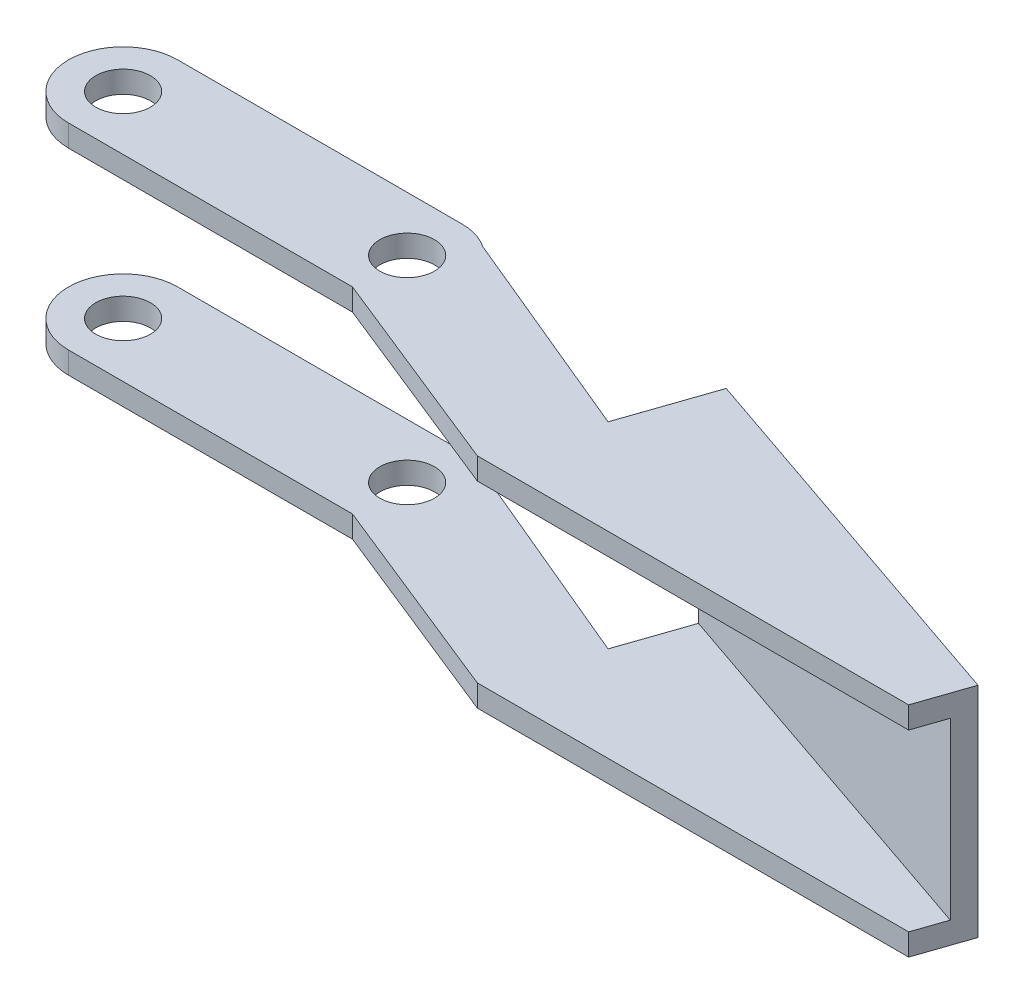
ISO-10303-21;
HEADER;
FILE_DESCRIPTION(('STEP AP214'),'2;1');
FILE_NAME('part.step','',(''),(''),'','','');
FILE_SCHEMA(('AUTOMOTIVE_DESIGN { 1 0 10303 214 1 1 1 1 }'));
ENDSEC;
DATA;
#1=APPLICATION_CONTEXT('core data for automotive mechanical design processes');
#2=APPLICATION_PROTOCOL_DEFINITION('international standard','automotive_design',2000,#1);
#3=PRODUCT_CONTEXT('',#1,'mechanical');
#4=PRODUCT('Part','Part','',(#3));
#5=PRODUCT_RELATED_PRODUCT_CATEGORY('part','',(#4));
#6=PRODUCT_DEFINITION_FORMATION('','',#4);
#7=PRODUCT_DEFINITION_CONTEXT('part definition',#1,'design');
#8=PRODUCT_DEFINITION('design','',#6,#7);
#9=PRODUCT_DEFINITION_SHAPE('','',#8);
#10=(LENGTH_UNIT() NAMED_UNIT(*) SI_UNIT(.MILLI.,.METRE.));
#11=(NAMED_UNIT(*) PLANE_ANGLE_UNIT() SI_UNIT($,.RADIAN.));
#12=(NAMED_UNIT(*) SI_UNIT($,.STERADIAN.) SOLID_ANGLE_UNIT());
#13=UNCERTAINTY_MEASURE_WITH_UNIT(LENGTH_MEASURE(1.E-05),#10,'distance_accuracy_value','');
#14=(GEOMETRIC_REPRESENTATION_CONTEXT(3) GLOBAL_UNCERTAINTY_ASSIGNED_CONTEXT((#13)) GLOBAL_UNIT_ASSIGNED_CONTEXT((#10,
#11,#12)) REPRESENTATION_CONTEXT('',''));
#15=CARTESIAN_POINT('',(0.,0.,0.));
#16=DIRECTION('',(0.,0.,1.));
#17=DIRECTION('',(1.,0.,0.));
#18=AXIS2_PLACEMENT_3D('',#15,#16,#17);
#19=CARTESIAN_POINT('',(0.,0.,0.));
#20=DIRECTION('',(0.,1.,0.));
#21=DIRECTION('',(0.,0.,1.));
#22=AXIS2_PLACEMENT_3D('',#19,#20,#21);
#23=PLANE('',#22);
#24=CARTESIAN_POINT('',(26.,0.,0.));
#25=DIRECTION('',(0.,1.,0.));
#26=DIRECTION('',(0.,0.,1.));
#27=AXIS2_PLACEMENT_3D('',#24,#25,#26);
#28=CIRCLE('',#27,2.5);
#29=CARTESIAN_POINT('',(26.,0.,2.5));
#30=VERTEX_POINT('',#29);
#31=EDGE_CURVE('E246',#30,#30,#28,.T.);
#32=ORIENTED_EDGE('',*,*,#31,.T.);
#33=EDGE_LOOP('',(#32));
#34=FACE_BOUND('',#33,.T.);
#35=CARTESIAN_POINT('',(0.,0.,0.));
#36=DIRECTION('',(0.,1.,0.));
#37=DIRECTION('',(0.,0.,1.));
#38=AXIS2_PLACEMENT_3D('',#35,#36,#37);
#39=CIRCLE('',#38,2.5);
#40=CARTESIAN_POINT('',(0.,0.,2.5));
#41=VERTEX_POINT('',#40);
#42=EDGE_CURVE('E259',#41,#41,#39,.T.);
#43=ORIENTED_EDGE('',*,*,#42,.T.);
#44=EDGE_LOOP('',(#43));
#45=FACE_BOUND('',#44,.T.);
#46=DIRECTION('',(-0.946071645942683,0.,-0.323957467491184));
#47=VECTOR('',#46,1.);
#48=CARTESIAN_POINT('',(50.5028094726619,0.,-2.16332017115032));
#49=LINE('',#48,#47);
#50=CARTESIAN_POINT('',(85.55613766588,0.,9.83977439078125));
#51=VERTEX_POINT('',#50);
#52=CARTESIAN_POINT('',(50.5028094726619,0.,-2.16332017115032));
#53=VERTEX_POINT('',#52);
#54=EDGE_CURVE('E50',#51,#53,#49,.T.);
#55=ORIENTED_EDGE('',*,*,#54,.F.);
#56=DIRECTION('',(0.323957467491184,0.,-0.946071645942683));
#57=VECTOR('',#56,1.);
#58=CARTESIAN_POINT('',(86.2040526008624,0.,7.94763109889588));
#59=LINE('',#58,#57);
#60=CARTESIAN_POINT('',(84.5842652634065,0.,12.6779893286093));
#61=VERTEX_POINT('',#60);
#62=EDGE_CURVE('E223',#61,#51,#59,.T.);
#63=ORIENTED_EDGE('',*,*,#62,.F.);
#64=DIRECTION('',(1.,0.,0.));
#65=VECTOR('',#64,1.);
#66=CARTESIAN_POINT('',(84.5842652634065,0.,12.6779893286093));
#67=LINE('',#66,#65);
#68=CARTESIAN_POINT('',(45.1031159492341,0.,12.6779893286093));
#69=VERTEX_POINT('',#68);
#70=EDGE_CURVE('E220',#69,#61,#67,.T.);
#71=ORIENTED_EDGE('',*,*,#70,.F.);
#72=DIRECTION('',(0.927860020821441,0.,0.372928655055139));
#73=VECTOR('',#72,1.);
#74=CARTESIAN_POINT('',(45.1031159492341,0.,12.6779893286093));
#75=LINE('',#74,#73);
#76=CARTESIAN_POINT('',(26.,0.,5.));
#77=VERTEX_POINT('',#76);
#78=EDGE_CURVE('E217',#77,#69,#75,.T.);
#79=ORIENTED_EDGE('',*,*,#78,.F.);
#80=DIRECTION('',(1.,0.,0.));
#81=VECTOR('',#80,1.);
#82=CARTESIAN_POINT('',(0.,0.,5.));
#83=LINE('',#82,#81);
#84=CARTESIAN_POINT('',(0.,0.,5.));
#85=VERTEX_POINT('',#84);
#86=EDGE_CURVE('E282',#85,#77,#83,.T.);
#87=ORIENTED_EDGE('',*,*,#86,.F.);
#88=CARTESIAN_POINT('',(0.,0.,0.));
#89=DIRECTION('',(0.,1.,0.));
#90=DIRECTION('',(0.,0.,1.));
#91=AXIS2_PLACEMENT_3D('',#88,#89,#90);
#92=CIRCLE('',#91,5.);
#93=CARTESIAN_POINT('',(0.,0.,-5.));
#94=VERTEX_POINT('',#93);
#95=EDGE_CURVE('E265',#94,#85,#92,.T.);
#96=ORIENTED_EDGE('',*,*,#95,.F.);
#97=DIRECTION('',(-1.,0.,0.));
#98=VECTOR('',#97,1.);
#99=CARTESIAN_POINT('',(0.,0.,-5.));
#100=LINE('',#99,#98);
#101=CARTESIAN_POINT('',(26.,0.,-5.));
#102=VERTEX_POINT('',#101);
#103=EDGE_CURVE('E272',#102,#94,#100,.T.);
#104=ORIENTED_EDGE('',*,*,#103,.F.);
#105=CARTESIAN_POINT('',(26.,0.,0.));
#106=DIRECTION('',(0.,1.,0.));
#107=DIRECTION('',(0.,0.,1.));
#108=AXIS2_PLACEMENT_3D('',#105,#106,#107);
#109=CIRCLE('',#108,5.);
#110=CARTESIAN_POINT('',(28.7977331353906,0.,-4.14399436572222));
#111=VERTEX_POINT('',#110);
#112=EDGE_CURVE('E285',#111,#102,#109,.T.);
#113=ORIENTED_EDGE('',*,*,#112,.F.);
#114=DIRECTION('',(-0.923418204726355,0.,-0.383795282904775));
#115=VECTOR('',#114,1.);
#116=CARTESIAN_POINT('',(28.7977331353906,0.,-4.14399436572222));
#117=LINE('',#116,#115);
#118=CARTESIAN_POINT('',(48.3923399718755,0.,4.00000543385411));
#119=VERTEX_POINT('',#118);
#120=EDGE_CURVE('E227',#119,#111,#117,.T.);
#121=ORIENTED_EDGE('',*,*,#120,.F.);
#122=DIRECTION('',(-0.323957467491184,0.,0.946071645942684));
#123=VECTOR('',#122,1.);
#124=CARTESIAN_POINT('',(48.3923399718755,0.,4.00000543385411));
#125=LINE('',#124,#123);
#126=EDGE_CURVE('E225',#53,#119,#125,.T.);
#127=ORIENTED_EDGE('',*,*,#126,.F.);
#128=EDGE_LOOP('',(#55,#63,#71,#79,#87,#96,#104,#113,#121,#127));
#129=FACE_BOUND('',#128,.T.);
#130=ADVANCED_FACE('F35',(#34,#45,#129),#23,.F.);
#131=CARTESIAN_POINT('',(0.,2.,0.));
#132=DIRECTION('',(0.,1.,0.));
#133=DIRECTION('',(0.,0.,1.));
#134=AXIS2_PLACEMENT_3D('',#131,#132,#133);
#135=PLANE('',#134);
#136=DIRECTION('',(-0.923418204726355,0.,-0.383795282904775));
#137=VECTOR('',#136,1.);
#138=CARTESIAN_POINT('',(28.7977331353906,2.,-4.14399436572222));
#139=LINE('',#138,#137);
#140=CARTESIAN_POINT('',(48.3923399718755,2.,4.00000543385411));
#141=VERTEX_POINT('',#140);
#142=CARTESIAN_POINT('',(28.7977331353906,2.,-4.14399436572223));
#143=VERTEX_POINT('',#142);
#144=EDGE_CURVE('E58',#141,#143,#139,.T.);
#145=ORIENTED_EDGE('',*,*,#144,.T.);
#146=CARTESIAN_POINT('',(26.,2.,0.));
#147=DIRECTION('',(0.,1.,0.));
#148=DIRECTION('',(0.,0.,1.));
#149=AXIS2_PLACEMENT_3D('',#146,#147,#148);
#150=CIRCLE('',#149,5.);
#151=CARTESIAN_POINT('',(26.,2.,-5.));
#152=VERTEX_POINT('',#151);
#153=EDGE_CURVE('E275',#143,#152,#150,.T.);
#154=ORIENTED_EDGE('',*,*,#153,.T.);
#155=DIRECTION('',(-1.,0.,0.));
#156=VECTOR('',#155,1.);
#157=CARTESIAN_POINT('',(0.,2.,-5.));
#158=LINE('',#157,#156);
#159=CARTESIAN_POINT('',(0.,2.,-5.));
#160=VERTEX_POINT('',#159);
#161=EDGE_CURVE('E277',#152,#160,#158,.T.);
#162=ORIENTED_EDGE('',*,*,#161,.T.);
#163=CARTESIAN_POINT('',(0.,2.,0.));
#164=DIRECTION('',(0.,1.,0.));
#165=DIRECTION('',(0.,0.,1.));
#166=AXIS2_PLACEMENT_3D('',#163,#164,#165);
#167=CIRCLE('',#166,5.);
#168=CARTESIAN_POINT('',(0.,2.,5.));
#169=VERTEX_POINT('',#168);
#170=EDGE_CURVE('E268',#160,#169,#167,.T.);
#171=ORIENTED_EDGE('',*,*,#170,.T.);
#172=DIRECTION('',(1.,0.,0.));
#173=VECTOR('',#172,1.);
#174=CARTESIAN_POINT('',(0.,2.,5.));
#175=LINE('',#174,#173);
#176=CARTESIAN_POINT('',(26.,2.,5.));
#177=VERTEX_POINT('',#176);
#178=EDGE_CURVE('E271',#169,#177,#175,.T.);
#179=ORIENTED_EDGE('',*,*,#178,.T.);
#180=DIRECTION('',(0.927860020821441,0.,0.372928655055139));
#181=VECTOR('',#180,1.);
#182=CARTESIAN_POINT('',(45.1031159492341,2.,12.6779893286093));
#183=LINE('',#182,#181);
#184=CARTESIAN_POINT('',(45.1031159492341,2.,12.6779893286093));
#185=VERTEX_POINT('',#184);
#186=EDGE_CURVE('E216',#177,#185,#183,.T.);
#187=ORIENTED_EDGE('',*,*,#186,.T.);
#188=DIRECTION('',(1.,0.,0.));
#189=VECTOR('',#188,1.);
#190=CARTESIAN_POINT('',(84.5842652634065,2.,12.6779893286093));
#191=LINE('',#190,#189);
#192=CARTESIAN_POINT('',(84.5842652634065,2.,12.6779893286093));
#193=VERTEX_POINT('',#192);
#194=EDGE_CURVE('E232',#185,#193,#191,.T.);
#195=ORIENTED_EDGE('',*,*,#194,.T.);
#196=DIRECTION('',(0.323957467491184,0.,-0.946071645942683));
#197=VECTOR('',#196,1.);
#198=CARTESIAN_POINT('',(86.2040526008624,2.,7.94763109889588));
#199=LINE('',#198,#197);
#200=CARTESIAN_POINT('',(86.2040526008624,2.,7.94763109889588));
#201=VERTEX_POINT('',#200);
#202=EDGE_CURVE('E235',#193,#201,#199,.T.);
#203=ORIENTED_EDGE('',*,*,#202,.T.);
#204=DIRECTION('',(-0.946071645942683,0.,-0.323957467491184));
#205=VECTOR('',#204,1.);
#206=CARTESIAN_POINT('',(51.1507244076443,2.,-4.05546346303569));
#207=LINE('',#206,#205);
#208=CARTESIAN_POINT('',(51.1507244076443,2.,-4.05546346303569));
#209=VERTEX_POINT('',#208);
#210=EDGE_CURVE('E238',#201,#209,#207,.T.);
#211=ORIENTED_EDGE('',*,*,#210,.T.);
#212=DIRECTION('',(-0.323957467491184,0.,0.946071645942684));
#213=VECTOR('',#212,1.);
#214=CARTESIAN_POINT('',(48.3923399718755,2.,4.00000543385411));
#215=LINE('',#214,#213);
#216=EDGE_CURVE('E241',#209,#141,#215,.T.);
#217=ORIENTED_EDGE('',*,*,#216,.T.);
#218=EDGE_LOOP('',(#145,#154,#162,#171,#179,#187,#195,#203,#211,#217));
#219=FACE_BOUND('',#218,.T.);
#220=CARTESIAN_POINT('',(0.,2.,0.));
#221=DIRECTION('',(0.,1.,0.));
#222=DIRECTION('',(0.,0.,1.));
#223=AXIS2_PLACEMENT_3D('',#220,#221,#222);
#224=CIRCLE('',#223,2.5);
#225=CARTESIAN_POINT('',(0.,2.,2.5));
#226=VERTEX_POINT('',#225);
#227=EDGE_CURVE('E262',#226,#226,#224,.T.);
#228=ORIENTED_EDGE('',*,*,#227,.F.);
#229=EDGE_LOOP('',(#228));
#230=FACE_BOUND('',#229,.T.);
#231=CARTESIAN_POINT('',(26.,2.,0.));
#232=DIRECTION('',(0.,1.,0.));
#233=DIRECTION('',(0.,0.,1.));
#234=AXIS2_PLACEMENT_3D('',#231,#232,#233);
#235=CIRCLE('',#234,2.5);
#236=CARTESIAN_POINT('',(26.,2.,2.5));
#237=VERTEX_POINT('',#236);
#238=EDGE_CURVE('E256',#237,#237,#235,.T.);
#239=ORIENTED_EDGE('',*,*,#238,.F.);
#240=EDGE_LOOP('',(#239));
#241=FACE_BOUND('',#240,.T.);
#242=ADVANCED_FACE('F410',(#219,#230,#241),#135,.T.);
#243=CARTESIAN_POINT('',(0.,2.,0.));
#244=DIRECTION('',(0.,-1.,0.));
#245=DIRECTION('',(0.,0.,-1.));
#246=AXIS2_PLACEMENT_3D('',#243,#244,#245);
#247=CYLINDRICAL_SURFACE('',#246,5.);
#248=ORIENTED_EDGE('',*,*,#95,.T.);
#249=DIRECTION('',(0.,-1.,0.));
#250=VECTOR('',#249,1.);
#251=CARTESIAN_POINT('',(0.,2.,5.));
#252=LINE('',#251,#250);
#253=EDGE_CURVE('E11',#169,#85,#252,.T.);
#254=ORIENTED_EDGE('',*,*,#253,.F.);
#255=ORIENTED_EDGE('',*,*,#170,.F.);
#256=DIRECTION('',(0.,-1.,0.));
#257=VECTOR('',#256,1.);
#258=CARTESIAN_POINT('',(0.,2.,-5.));
#259=LINE('',#258,#257);
#260=EDGE_CURVE('E279',#160,#94,#259,.T.);
#261=ORIENTED_EDGE('',*,*,#260,.T.);
#262=EDGE_LOOP('',(#248,#254,#255,#261));
#263=FACE_BOUND('',#262,.T.);
#264=ADVANCED_FACE('F37',(#263),#247,.T.);
#265=CARTESIAN_POINT('',(0.,2.,5.));
#266=DIRECTION('',(0.,0.,-1.));
#267=DIRECTION('',(-1.,0.,0.));
#268=AXIS2_PLACEMENT_3D('',#265,#266,#267);
#269=PLANE('',#268);
#270=ORIENTED_EDGE('',*,*,#86,.T.);
#271=DIRECTION('',(0.,-1.,0.));
#272=VECTOR('',#271,1.);
#273=CARTESIAN_POINT('',(26.,2.,5.));
#274=LINE('',#273,#272);
#275=EDGE_CURVE('E43',#177,#77,#274,.T.);
#276=ORIENTED_EDGE('',*,*,#275,.F.);
#277=ORIENTED_EDGE('',*,*,#178,.F.);
#278=ORIENTED_EDGE('',*,*,#253,.T.);
#279=EDGE_LOOP('',(#270,#276,#277,#278));
#280=FACE_BOUND('',#279,.T.);
#281=ADVANCED_FACE('F299',(#280),#269,.F.);
#282=CARTESIAN_POINT('',(26.,2.,0.));
#283=DIRECTION('',(0.,-1.,0.));
#284=DIRECTION('',(0.,0.,-1.));
#285=AXIS2_PLACEMENT_3D('',#282,#283,#284);
#286=CYLINDRICAL_SURFACE('',#285,5.);
#287=ORIENTED_EDGE('',*,*,#153,.F.);
#288=DIRECTION('',(0.,1.,0.));
#289=VECTOR('',#288,1.);
#290=CARTESIAN_POINT('',(28.7977331353906,0.,-4.14399436572222));
#291=LINE('',#290,#289);
#292=EDGE_CURVE('E244',#111,#143,#291,.T.);
#293=ORIENTED_EDGE('',*,*,#292,.F.);
#294=ORIENTED_EDGE('',*,*,#112,.T.);
#295=DIRECTION('',(0.,-1.,0.));
#296=VECTOR('',#295,1.);
#297=CARTESIAN_POINT('',(26.,2.,-5.));
#298=LINE('',#297,#296);
#299=EDGE_CURVE('E290',#152,#102,#298,.T.);
#300=ORIENTED_EDGE('',*,*,#299,.F.);
#301=EDGE_LOOP('',(#287,#293,#294,#300));
#302=FACE_BOUND('',#301,.T.);
#303=ADVANCED_FACE('F313',(#302),#286,.T.);
#304=CARTESIAN_POINT('',(0.,2.,-5.));
#305=DIRECTION('',(0.,0.,1.));
#306=DIRECTION('',(1.,0.,0.));
#307=AXIS2_PLACEMENT_3D('',#304,#305,#306);
#308=PLANE('',#307);
#309=ORIENTED_EDGE('',*,*,#103,.T.);
#310=ORIENTED_EDGE('',*,*,#260,.F.);
#311=ORIENTED_EDGE('',*,*,#161,.F.);
#312=ORIENTED_EDGE('',*,*,#299,.T.);
#313=EDGE_LOOP('',(#309,#310,#311,#312));
#314=FACE_BOUND('',#313,.T.);
#315=ADVANCED_FACE('F308',(#314),#308,.F.);
#316=CARTESIAN_POINT('',(0.,2.,0.));
#317=DIRECTION('',(0.,-1.,0.));
#318=DIRECTION('',(0.,0.,-1.));
#319=AXIS2_PLACEMENT_3D('',#316,#317,#318);
#320=CYLINDRICAL_SURFACE('',#319,2.5);
#321=ORIENTED_EDGE('',*,*,#227,.T.);
#322=EDGE_LOOP('',(#321));
#323=FACE_BOUND('',#322,.T.);
#324=ORIENTED_EDGE('',*,*,#42,.F.);
#325=EDGE_LOOP('',(#324));
#326=FACE_BOUND('',#325,.T.);
#327=ADVANCED_FACE('F438',(#323,#326),#320,.F.);
#328=CARTESIAN_POINT('',(26.,2.,0.));
#329=DIRECTION('',(0.,-1.,0.));
#330=DIRECTION('',(0.,0.,-1.));
#331=AXIS2_PLACEMENT_3D('',#328,#329,#330);
#332=CYLINDRICAL_SURFACE('',#331,2.5);
#333=ORIENTED_EDGE('',*,*,#238,.T.);
#334=EDGE_LOOP('',(#333));
#335=FACE_BOUND('',#334,.T.);
#336=ORIENTED_EDGE('',*,*,#31,.F.);
#337=EDGE_LOOP('',(#336));
#338=FACE_BOUND('',#337,.T.);
#339=ADVANCED_FACE('F468',(#335,#338),#332,.F.);
#340=CARTESIAN_POINT('',(28.7977331353906,0.,-4.14399436572222));
#341=DIRECTION('',(0.383795282904775,0.,-0.923418204726355));
#342=DIRECTION('',(-0.923418204726355,0.,-0.383795282904775));
#343=AXIS2_PLACEMENT_3D('',#340,#341,#342);
#344=PLANE('',#343);
#345=ORIENTED_EDGE('',*,*,#144,.F.);
#346=DIRECTION('',(0.,1.,0.));
#347=VECTOR('',#346,1.);
#348=CARTESIAN_POINT('',(48.3923399718755,0.,4.00000543385411));
#349=LINE('',#348,#347);
#350=EDGE_CURVE('E247',#119,#141,#349,.T.);
#351=ORIENTED_EDGE('',*,*,#350,.F.);
#352=ORIENTED_EDGE('',*,*,#120,.T.);
#353=ORIENTED_EDGE('',*,*,#292,.T.);
#354=EDGE_LOOP('',(#345,#351,#352,#353));
#355=FACE_BOUND('',#354,.T.);
#356=ADVANCED_FACE('F316',(#355),#344,.T.);
#357=CARTESIAN_POINT('',(48.3923399718755,0.,4.00000543385411));
#358=DIRECTION('',(-0.946071645942684,0.,-0.323957467491184));
#359=DIRECTION('',(-0.323957467491184,0.,0.946071645942684));
#360=AXIS2_PLACEMENT_3D('',#357,#358,#359);
#361=PLANE('',#360);
#362=ORIENTED_EDGE('',*,*,#216,.F.);
#363=DIRECTION('',(0.,1.,0.));
#364=VECTOR('',#363,1.);
#365=CARTESIAN_POINT('',(51.1507244076443,0.,-4.05546346303569));
#366=LINE('',#365,#364);
#367=CARTESIAN_POINT('',(51.1507244076443,-18.,-4.05546346303569));
#368=VERTEX_POINT('',#367);
#369=EDGE_CURVE('E249',#368,#209,#366,.T.);
#370=ORIENTED_EDGE('',*,*,#369,.F.);
#371=DIRECTION('',(-0.323957467491184,0.,0.946071645942684));
#372=VECTOR('',#371,1.);
#373=CARTESIAN_POINT('',(44.5395889112522,-18.,15.2514161994681));
#374=LINE('',#373,#372);
#375=CARTESIAN_POINT('',(48.3923399718755,-18.,4.00000543385411));
#376=VERTEX_POINT('',#375);
#377=EDGE_CURVE('E398',#368,#376,#374,.T.);
#378=ORIENTED_EDGE('',*,*,#377,.T.);
#379=DIRECTION('',(0.,1.,0.));
#380=VECTOR('',#379,1.);
#381=CARTESIAN_POINT('',(48.3923399718755,-18.,4.00000543385411));
#382=LINE('',#381,#380);
#383=CARTESIAN_POINT('',(48.3923399718755,-16.,4.00000543385411));
#384=VERTEX_POINT('',#383);
#385=EDGE_CURVE('E204',#376,#384,#382,.T.);
#386=ORIENTED_EDGE('',*,*,#385,.T.);
#387=DIRECTION('',(-0.323957467491184,0.,0.946071645942684));
#388=VECTOR('',#387,1.);
#389=CARTESIAN_POINT('',(44.5395889112522,-16.,15.2514161994681));
#390=LINE('',#389,#388);
#391=CARTESIAN_POINT('',(50.5028094726619,-16.,-2.16332017115032));
#392=VERTEX_POINT('',#391);
#393=EDGE_CURVE('E326',#392,#384,#390,.T.);
#394=ORIENTED_EDGE('',*,*,#393,.F.);
#395=DIRECTION('',(0.,1.,0.));
#396=VECTOR('',#395,1.);
#397=CARTESIAN_POINT('',(50.5028094726619,-16.,-2.16332017115032));
#398=LINE('',#397,#396);
#399=EDGE_CURVE('E209',#392,#53,#398,.T.);
#400=ORIENTED_EDGE('',*,*,#399,.T.);
#401=ORIENTED_EDGE('',*,*,#126,.T.);
#402=ORIENTED_EDGE('',*,*,#350,.T.);
#403=EDGE_LOOP('',(#362,#370,#378,#386,#394,#400,#401,#402));
#404=FACE_BOUND('',#403,.T.);
#405=ADVANCED_FACE('F324',(#404),#361,.T.);
#406=CARTESIAN_POINT('',(51.1507244076443,0.,-4.05546346303569));
#407=DIRECTION('',(0.323957467491184,0.,-0.946071645942683));
#408=DIRECTION('',(-0.946071645942684,0.,-0.323957467491184));
#409=AXIS2_PLACEMENT_3D('',#406,#407,#408);
#410=PLANE('',#409);
#411=ORIENTED_EDGE('',*,*,#210,.F.);
#412=DIRECTION('',(0.,1.,0.));
#413=VECTOR('',#412,1.);
#414=CARTESIAN_POINT('',(86.2040526008624,0.,7.94763109889588));
#415=LINE('',#414,#413);
#416=CARTESIAN_POINT('',(86.2040526008624,-18.,7.94763109889588));
#417=VERTEX_POINT('',#416);
#418=EDGE_CURVE('E251',#417,#201,#415,.T.);
#419=ORIENTED_EDGE('',*,*,#418,.F.);
#420=DIRECTION('',(0.946071645942684,0.,0.323957467491184));
#421=VECTOR('',#420,1.);
#422=CARTESIAN_POINT('',(6.6111354963921,-18.,-19.3068796625038));
#423=LINE('',#422,#421);
#424=EDGE_CURVE('E400',#368,#417,#423,.T.);
#425=ORIENTED_EDGE('',*,*,#424,.F.);
#426=ORIENTED_EDGE('',*,*,#369,.T.);
#427=EDGE_LOOP('',(#411,#419,#425,#426));
#428=FACE_BOUND('',#427,.T.);
#429=ADVANCED_FACE('F409',(#428),#410,.T.);
#430=CARTESIAN_POINT('',(86.2040526008624,0.,7.94763109889588));
#431=DIRECTION('',(0.946071645942683,0.,0.323957467491184));
#432=DIRECTION('',(0.323957467491185,0.,-0.946071645942684));
#433=AXIS2_PLACEMENT_3D('',#430,#431,#432);
#434=PLANE('',#433);
#435=ORIENTED_EDGE('',*,*,#202,.F.);
#436=DIRECTION('',(0.,1.,0.));
#437=VECTOR('',#436,1.);
#438=CARTESIAN_POINT('',(84.5842652634065,0.,12.6779893286093));
#439=LINE('',#438,#437);
#440=EDGE_CURVE('E253',#61,#193,#439,.T.);
#441=ORIENTED_EDGE('',*,*,#440,.F.);
#442=ORIENTED_EDGE('',*,*,#62,.T.);
#443=DIRECTION('',(0.,1.,0.));
#444=VECTOR('',#443,1.);
#445=CARTESIAN_POINT('',(85.55613766588,-16.,9.83977439078125));
#446=LINE('',#445,#444);
#447=CARTESIAN_POINT('',(85.55613766588,-16.,9.83977439078125));
#448=VERTEX_POINT('',#447);
#449=EDGE_CURVE('E213',#448,#51,#446,.T.);
#450=ORIENTED_EDGE('',*,*,#449,.F.);
#451=DIRECTION('',(-0.323957467491185,0.,0.946071645942684));
#452=VECTOR('',#451,1.);
#453=CARTESIAN_POINT('',(79.5929171044703,-16.,27.2545107613997));
#454=LINE('',#453,#452);
#455=CARTESIAN_POINT('',(84.5842652634065,-16.,12.6779893286093));
#456=VERTEX_POINT('',#455);
#457=EDGE_CURVE('E331',#448,#456,#454,.T.);
#458=ORIENTED_EDGE('',*,*,#457,.T.);
#459=DIRECTION('',(0.,1.,0.));
#460=VECTOR('',#459,1.);
#461=CARTESIAN_POINT('',(84.5842652634065,-18.,12.6779893286093));
#462=LINE('',#461,#460);
#463=CARTESIAN_POINT('',(84.5842652634065,-18.,12.6779893286093));
#464=VERTEX_POINT('',#463);
#465=EDGE_CURVE('E359',#464,#456,#462,.T.);
#466=ORIENTED_EDGE('',*,*,#465,.F.);
#467=DIRECTION('',(-0.323957467491185,0.,0.946071645942684));
#468=VECTOR('',#467,1.);
#469=CARTESIAN_POINT('',(79.5929171044703,-18.,27.2545107613997));
#470=LINE('',#469,#468);
#471=EDGE_CURVE('E384',#417,#464,#470,.T.);
#472=ORIENTED_EDGE('',*,*,#471,.F.);
#473=ORIENTED_EDGE('',*,*,#418,.T.);
#474=EDGE_LOOP('',(#435,#441,#442,#450,#458,#466,#472,#473));
#475=FACE_BOUND('',#474,.T.);
#476=ADVANCED_FACE('F406',(#475),#434,.T.);
#477=CARTESIAN_POINT('',(84.5842652634065,0.,12.6779893286093));
#478=DIRECTION('',(0.,0.,1.));
#479=DIRECTION('',(1.,0.,0.));
#480=AXIS2_PLACEMENT_3D('',#477,#478,#479);
#481=PLANE('',#480);
#482=ORIENTED_EDGE('',*,*,#194,.F.);
#483=DIRECTION('',(0.,1.,0.));
#484=VECTOR('',#483,1.);
#485=CARTESIAN_POINT('',(45.1031159492341,0.,12.6779893286093));
#486=LINE('',#485,#484);
#487=EDGE_CURVE('E229',#69,#185,#486,.T.);
#488=ORIENTED_EDGE('',*,*,#487,.F.);
#489=ORIENTED_EDGE('',*,*,#70,.T.);
#490=ORIENTED_EDGE('',*,*,#440,.T.);
#491=EDGE_LOOP('',(#482,#488,#489,#490));
#492=FACE_BOUND('',#491,.T.);
#493=ADVANCED_FACE('F414',(#492),#481,.T.);
#494=CARTESIAN_POINT('',(45.1031159492341,0.,12.6779893286093));
#495=DIRECTION('',(-0.372928655055139,0.,0.927860020821441));
#496=DIRECTION('',(0.927860020821441,0.,0.372928655055139));
#497=AXIS2_PLACEMENT_3D('',#494,#495,#496);
#498=PLANE('',#497);
#499=ORIENTED_EDGE('',*,*,#186,.F.);
#500=ORIENTED_EDGE('',*,*,#275,.T.);
#501=ORIENTED_EDGE('',*,*,#78,.T.);
#502=ORIENTED_EDGE('',*,*,#487,.T.);
#503=EDGE_LOOP('',(#499,#500,#501,#502));
#504=FACE_BOUND('',#503,.T.);
#505=ADVANCED_FACE('F295',(#504),#498,.T.);
#506=CARTESIAN_POINT('',(50.5028094726619,-16.,-2.16332017115032));
#507=DIRECTION('',(0.323957467491184,0.,-0.946071645942683));
#508=DIRECTION('',(-0.946071645942684,0.,-0.323957467491184));
#509=AXIS2_PLACEMENT_3D('',#506,#507,#508);
#510=PLANE('',#509);
#511=ORIENTED_EDGE('',*,*,#54,.T.);
#512=ORIENTED_EDGE('',*,*,#399,.F.);
#513=DIRECTION('',(-0.946071645942683,0.,-0.323957467491184));
#514=VECTOR('',#513,1.);
#515=CARTESIAN_POINT('',(50.5028094726619,-16.,-2.16332017115032));
#516=LINE('',#515,#514);
#517=EDGE_CURVE('E202',#448,#392,#516,.T.);
#518=ORIENTED_EDGE('',*,*,#517,.F.);
#519=ORIENTED_EDGE('',*,*,#449,.T.);
#520=EDGE_LOOP('',(#511,#512,#518,#519));
#521=FACE_BOUND('',#520,.T.);
#522=ADVANCED_FACE('F320',(#521),#510,.F.);
#523=CARTESIAN_POINT('',(0.,-16.,0.));
#524=DIRECTION('',(0.,-1.,0.));
#525=DIRECTION('',(0.,0.,-1.));
#526=AXIS2_PLACEMENT_3D('',#523,#524,#525);
#527=PLANE('',#526);
#528=CARTESIAN_POINT('',(26.,-16.,0.));
#529=DIRECTION('',(0.,-1.,0.));
#530=DIRECTION('',(0.,0.,-1.));
#531=AXIS2_PLACEMENT_3D('',#528,#529,#530);
#532=CIRCLE('',#531,2.5);
#533=CARTESIAN_POINT('',(26.,-16.,-2.5));
#534=VERTEX_POINT('',#533);
#535=EDGE_CURVE('E389',#534,#534,#532,.T.);
#536=ORIENTED_EDGE('',*,*,#535,.T.);
#537=EDGE_LOOP('',(#536));
#538=FACE_BOUND('',#537,.T.);
#539=CARTESIAN_POINT('',(0.,-16.,0.));
#540=DIRECTION('',(0.,-1.,0.));
#541=DIRECTION('',(0.,0.,-1.));
#542=AXIS2_PLACEMENT_3D('',#539,#540,#541);
#543=CIRCLE('',#542,2.5);
#544=CARTESIAN_POINT('',(0.,-16.,-2.5));
#545=VERTEX_POINT('',#544);
#546=EDGE_CURVE('E392',#545,#545,#543,.T.);
#547=ORIENTED_EDGE('',*,*,#546,.T.);
#548=EDGE_LOOP('',(#547));
#549=FACE_BOUND('',#548,.T.);
#550=ORIENTED_EDGE('',*,*,#457,.F.);
#551=ORIENTED_EDGE('',*,*,#517,.T.);
#552=ORIENTED_EDGE('',*,*,#393,.T.);
#553=DIRECTION('',(-0.922126073459837,0.,-0.386889525117369));
#554=VECTOR('',#553,1.);
#555=CARTESIAN_POINT('',(5.81648943176526,-16.,-13.863225062522));
#556=LINE('',#555,#554);
#557=CARTESIAN_POINT('',(27.4628786982161,-16.,-4.78121176212742));
#558=VERTEX_POINT('',#557);
#559=EDGE_CURVE('E332',#384,#558,#556,.T.);
#560=ORIENTED_EDGE('',*,*,#559,.T.);
#561=CARTESIAN_POINT('',(26.,-16.,0.));
#562=DIRECTION('',(0.,-1.,0.));
#563=DIRECTION('',(0.,0.,-1.));
#564=AXIS2_PLACEMENT_3D('',#561,#562,#563);
#565=CIRCLE('',#564,5.);
#566=CARTESIAN_POINT('',(26.,-16.,-5.));
#567=VERTEX_POINT('',#566);
#568=EDGE_CURVE('E336',#567,#558,#565,.T.);
#569=ORIENTED_EDGE('',*,*,#568,.F.);
#570=DIRECTION('',(1.,0.,0.));
#571=VECTOR('',#570,1.);
#572=CARTESIAN_POINT('',(0.,-16.,-5.));
#573=LINE('',#572,#571);
#574=CARTESIAN_POINT('',(0.,-16.,-5.));
#575=VERTEX_POINT('',#574);
#576=EDGE_CURVE('E200',#575,#567,#573,.T.);
#577=ORIENTED_EDGE('',*,*,#576,.F.);
#578=CARTESIAN_POINT('',(0.,-16.,0.));
#579=DIRECTION('',(0.,-1.,0.));
#580=DIRECTION('',(0.,0.,-1.));
#581=AXIS2_PLACEMENT_3D('',#578,#579,#580);
#582=CIRCLE('',#581,5.);
#583=CARTESIAN_POINT('',(0.,-16.,5.));
#584=VERTEX_POINT('',#583);
#585=EDGE_CURVE('E347',#584,#575,#582,.T.);
#586=ORIENTED_EDGE('',*,*,#585,.F.);
#587=DIRECTION('',(1.,0.,0.));
#588=VECTOR('',#587,1.);
#589=CARTESIAN_POINT('',(0.,-16.,5.));
#590=LINE('',#589,#588);
#591=CARTESIAN_POINT('',(26.,-16.,5.));
#592=VERTEX_POINT('',#591);
#593=EDGE_CURVE('E344',#584,#592,#590,.T.);
#594=ORIENTED_EDGE('',*,*,#593,.T.);
#595=DIRECTION('',(-0.927860020821441,0.,-0.372928655055139));
#596=VECTOR('',#595,1.);
#597=CARTESIAN_POINT('',(1.88584237757024,-16.,-4.69204423955988));
#598=LINE('',#597,#596);
#599=CARTESIAN_POINT('',(45.1031159492341,-16.,12.6779893286093));
#600=VERTEX_POINT('',#599);
#601=EDGE_CURVE('E341',#600,#592,#598,.T.);
#602=ORIENTED_EDGE('',*,*,#601,.F.);
#603=DIRECTION('',(-1.,0.,0.));
#604=VECTOR('',#603,1.);
#605=CARTESIAN_POINT('',(0.,-16.,12.6779893286093));
#606=LINE('',#605,#604);
#607=EDGE_CURVE('E334',#456,#600,#606,.T.);
#608=ORIENTED_EDGE('',*,*,#607,.F.);
#609=EDGE_LOOP('',(#550,#551,#552,#560,#569,#577,#586,#594,#602,#608));
#610=FACE_BOUND('',#609,.T.);
#611=ADVANCED_FACE('F372',(#538,#549,#610),#527,.F.);
#612=CARTESIAN_POINT('',(0.,-18.,-5.));
#613=DIRECTION('',(0.,0.,1.));
#614=DIRECTION('',(1.,0.,0.));
#615=AXIS2_PLACEMENT_3D('',#612,#613,#614);
#616=PLANE('',#615);
#617=ORIENTED_EDGE('',*,*,#576,.T.);
#618=DIRECTION('',(0.,1.,0.));
#619=VECTOR('',#618,1.);
#620=CARTESIAN_POINT('',(26.,-18.,-5.));
#621=LINE('',#620,#619);
#622=CARTESIAN_POINT('',(26.,-18.,-5.));
#623=VERTEX_POINT('',#622);
#624=EDGE_CURVE('E179',#623,#567,#621,.T.);
#625=ORIENTED_EDGE('',*,*,#624,.F.);
#626=DIRECTION('',(1.,0.,0.));
#627=VECTOR('',#626,1.);
#628=CARTESIAN_POINT('',(0.,-18.,-5.));
#629=LINE('',#628,#627);
#630=CARTESIAN_POINT('',(0.,-18.,-5.));
#631=VERTEX_POINT('',#630);
#632=EDGE_CURVE('E186',#631,#623,#629,.T.);
#633=ORIENTED_EDGE('',*,*,#632,.F.);
#634=DIRECTION('',(0.,1.,0.));
#635=VECTOR('',#634,1.);
#636=CARTESIAN_POINT('',(0.,-18.,-5.));
#637=LINE('',#636,#635);
#638=EDGE_CURVE('E350',#631,#575,#637,.T.);
#639=ORIENTED_EDGE('',*,*,#638,.T.);
#640=EDGE_LOOP('',(#617,#625,#633,#639));
#641=FACE_BOUND('',#640,.T.);
#642=ADVANCED_FACE('F198',(#641),#616,.F.);
#643=CARTESIAN_POINT('',(26.,-18.,0.));
#644=DIRECTION('',(0.,1.,0.));
#645=DIRECTION('',(0.,0.,1.));
#646=AXIS2_PLACEMENT_3D('',#643,#644,#645);
#647=CYLINDRICAL_SURFACE('',#646,5.);
#648=ORIENTED_EDGE('',*,*,#568,.T.);
#649=DIRECTION('',(0.,1.,0.));
#650=VECTOR('',#649,1.);
#651=CARTESIAN_POINT('',(27.4628786982161,-18.,-4.78121176212742));
#652=LINE('',#651,#650);
#653=CARTESIAN_POINT('',(27.4628786982161,-18.,-4.78121176212742));
#654=VERTEX_POINT('',#653);
#655=EDGE_CURVE('E181',#654,#558,#652,.T.);
#656=ORIENTED_EDGE('',*,*,#655,.F.);
#657=CARTESIAN_POINT('',(26.,-18.,0.));
#658=DIRECTION('',(0.,-1.,0.));
#659=DIRECTION('',(0.,0.,-1.));
#660=AXIS2_PLACEMENT_3D('',#657,#658,#659);
#661=CIRCLE('',#660,5.);
#662=EDGE_CURVE('E174',#623,#654,#661,.T.);
#663=ORIENTED_EDGE('',*,*,#662,.F.);
#664=ORIENTED_EDGE('',*,*,#624,.T.);
#665=EDGE_LOOP('',(#648,#656,#663,#664));
#666=FACE_BOUND('',#665,.T.);
#667=ADVANCED_FACE('F177',(#666),#647,.T.);
#668=CARTESIAN_POINT('',(5.81648943176526,-18.,-13.863225062522));
#669=DIRECTION('',(0.386889525117369,0.,-0.922126073459837));
#670=DIRECTION('',(-0.922126073459837,0.,-0.386889525117369));
#671=AXIS2_PLACEMENT_3D('',#668,#669,#670);
#672=PLANE('',#671);
#673=ORIENTED_EDGE('',*,*,#559,.F.);
#674=ORIENTED_EDGE('',*,*,#385,.F.);
#675=DIRECTION('',(-0.922126073459837,0.,-0.386889525117369));
#676=VECTOR('',#675,1.);
#677=CARTESIAN_POINT('',(5.81648943176526,-18.,-13.863225062522));
#678=LINE('',#677,#676);
#679=EDGE_CURVE('E185',#376,#654,#678,.T.);
#680=ORIENTED_EDGE('',*,*,#679,.T.);
#681=ORIENTED_EDGE('',*,*,#655,.T.);
#682=EDGE_LOOP('',(#673,#674,#680,#681));
#683=FACE_BOUND('',#682,.T.);
#684=ADVANCED_FACE('F396',(#683),#672,.T.);
#685=CARTESIAN_POINT('',(0.,-18.,12.6779893286093));
#686=DIRECTION('',(0.,0.,-1.));
#687=DIRECTION('',(-1.,0.,0.));
#688=AXIS2_PLACEMENT_3D('',#685,#686,#687);
#689=PLANE('',#688);
#690=ORIENTED_EDGE('',*,*,#607,.T.);
#691=DIRECTION('',(0.,1.,0.));
#692=VECTOR('',#691,1.);
#693=CARTESIAN_POINT('',(45.1031159492341,-18.,12.6779893286093));
#694=LINE('',#693,#692);
#695=CARTESIAN_POINT('',(45.1031159492341,-18.,12.6779893286093));
#696=VERTEX_POINT('',#695);
#697=EDGE_CURVE('E356',#696,#600,#694,.T.);
#698=ORIENTED_EDGE('',*,*,#697,.F.);
#699=DIRECTION('',(-1.,0.,0.));
#700=VECTOR('',#699,1.);
#701=CARTESIAN_POINT('',(0.,-18.,12.6779893286093));
#702=LINE('',#701,#700);
#703=EDGE_CURVE('E367',#464,#696,#702,.T.);
#704=ORIENTED_EDGE('',*,*,#703,.F.);
#705=ORIENTED_EDGE('',*,*,#465,.T.);
#706=EDGE_LOOP('',(#690,#698,#704,#705));
#707=FACE_BOUND('',#706,.T.);
#708=ADVANCED_FACE('F365',(#707),#689,.F.);
#709=CARTESIAN_POINT('',(1.88584237757024,-18.,-4.69204423955988));
#710=DIRECTION('',(0.372928655055139,0.,-0.927860020821441));
#711=DIRECTION('',(-0.927860020821441,0.,-0.372928655055139));
#712=AXIS2_PLACEMENT_3D('',#709,#710,#711);
#713=PLANE('',#712);
#714=ORIENTED_EDGE('',*,*,#601,.T.);
#715=DIRECTION('',(0.,1.,0.));
#716=VECTOR('',#715,1.);
#717=CARTESIAN_POINT('',(26.,-18.,5.));
#718=LINE('',#717,#716);
#719=CARTESIAN_POINT('',(26.,-18.,5.));
#720=VERTEX_POINT('',#719);
#721=EDGE_CURVE('E354',#720,#592,#718,.T.);
#722=ORIENTED_EDGE('',*,*,#721,.F.);
#723=DIRECTION('',(-0.927860020821441,0.,-0.372928655055139));
#724=VECTOR('',#723,1.);
#725=CARTESIAN_POINT('',(1.88584237757024,-18.,-4.69204423955988));
#726=LINE('',#725,#724);
#727=EDGE_CURVE('E380',#696,#720,#726,.T.);
#728=ORIENTED_EDGE('',*,*,#727,.F.);
#729=ORIENTED_EDGE('',*,*,#697,.T.);
#730=EDGE_LOOP('',(#714,#722,#728,#729));
#731=FACE_BOUND('',#730,.T.);
#732=ADVANCED_FACE('F377',(#731),#713,.F.);
#733=CARTESIAN_POINT('',(0.,-18.,5.));
#734=DIRECTION('',(0.,0.,1.));
#735=DIRECTION('',(1.,0.,0.));
#736=AXIS2_PLACEMENT_3D('',#733,#734,#735);
#737=PLANE('',#736);
#738=ORIENTED_EDGE('',*,*,#593,.F.);
#739=DIRECTION('',(0.,1.,0.));
#740=VECTOR('',#739,1.);
#741=CARTESIAN_POINT('',(0.,-18.,5.));
#742=LINE('',#741,#740);
#743=CARTESIAN_POINT('',(0.,-18.,5.));
#744=VERTEX_POINT('',#743);
#745=EDGE_CURVE('E352',#744,#584,#742,.T.);
#746=ORIENTED_EDGE('',*,*,#745,.F.);
#747=DIRECTION('',(1.,0.,0.));
#748=VECTOR('',#747,1.);
#749=CARTESIAN_POINT('',(0.,-18.,5.));
#750=LINE('',#749,#748);
#751=EDGE_CURVE('E381',#744,#720,#750,.T.);
#752=ORIENTED_EDGE('',*,*,#751,.T.);
#753=ORIENTED_EDGE('',*,*,#721,.T.);
#754=EDGE_LOOP('',(#738,#746,#752,#753));
#755=FACE_BOUND('',#754,.T.);
#756=ADVANCED_FACE('F563',(#755),#737,.T.);
#757=CARTESIAN_POINT('',(0.,-18.,0.));
#758=DIRECTION('',(0.,1.,0.));
#759=DIRECTION('',(0.,0.,1.));
#760=AXIS2_PLACEMENT_3D('',#757,#758,#759);
#761=CYLINDRICAL_SURFACE('',#760,2.5);
#762=CARTESIAN_POINT('',(0.,-18.,0.));
#763=DIRECTION('',(0.,-1.,0.));
#764=DIRECTION('',(0.,0.,-1.));
#765=AXIS2_PLACEMENT_3D('',#762,#763,#764);
#766=CIRCLE('',#765,2.5);
#767=CARTESIAN_POINT('',(0.,-18.,-2.5));
#768=VERTEX_POINT('',#767);
#769=EDGE_CURVE('E196',#768,#768,#766,.T.);
#770=ORIENTED_EDGE('',*,*,#769,.T.);
#771=EDGE_LOOP('',(#770));
#772=FACE_BOUND('',#771,.T.);
#773=ORIENTED_EDGE('',*,*,#546,.F.);
#774=EDGE_LOOP('',(#773));
#775=FACE_BOUND('',#774,.T.);
#776=ADVANCED_FACE('F570',(#772,#775),#761,.F.);
#777=CARTESIAN_POINT('',(26.,-18.,0.));
#778=DIRECTION('',(0.,1.,0.));
#779=DIRECTION('',(0.,0.,1.));
#780=AXIS2_PLACEMENT_3D('',#777,#778,#779);
#781=CYLINDRICAL_SURFACE('',#780,2.5);
#782=CARTESIAN_POINT('',(26.,-18.,0.));
#783=DIRECTION('',(0.,-1.,0.));
#784=DIRECTION('',(0.,0.,-1.));
#785=AXIS2_PLACEMENT_3D('',#782,#783,#784);
#786=CIRCLE('',#785,2.5);
#787=CARTESIAN_POINT('',(26.,-18.,-2.5));
#788=VERTEX_POINT('',#787);
#789=EDGE_CURVE('E349',#788,#788,#786,.T.);
#790=ORIENTED_EDGE('',*,*,#789,.T.);
#791=EDGE_LOOP('',(#790));
#792=FACE_BOUND('',#791,.T.);
#793=ORIENTED_EDGE('',*,*,#535,.F.);
#794=EDGE_LOOP('',(#793));
#795=FACE_BOUND('',#794,.T.);
#796=ADVANCED_FACE('F578',(#792,#795),#781,.F.);
#797=CARTESIAN_POINT('',(0.,-18.,0.));
#798=DIRECTION('',(0.,1.,0.));
#799=DIRECTION('',(0.,0.,1.));
#800=AXIS2_PLACEMENT_3D('',#797,#798,#799);
#801=CYLINDRICAL_SURFACE('',#800,5.);
#802=ORIENTED_EDGE('',*,*,#585,.T.);
#803=ORIENTED_EDGE('',*,*,#638,.F.);
#804=CARTESIAN_POINT('',(0.,-18.,0.));
#805=DIRECTION('',(0.,-1.,0.));
#806=DIRECTION('',(0.,0.,-1.));
#807=AXIS2_PLACEMENT_3D('',#804,#805,#806);
#808=CIRCLE('',#807,5.);
#809=EDGE_CURVE('E192',#744,#631,#808,.T.);
#810=ORIENTED_EDGE('',*,*,#809,.F.);
#811=ORIENTED_EDGE('',*,*,#745,.T.);
#812=EDGE_LOOP('',(#802,#803,#810,#811));
#813=FACE_BOUND('',#812,.T.);
#814=ADVANCED_FACE('F586',(#813),#801,.T.);
#815=CARTESIAN_POINT('',(0.,-18.,0.));
#816=DIRECTION('',(0.,-1.,0.));
#817=DIRECTION('',(0.,0.,-1.));
#818=AXIS2_PLACEMENT_3D('',#815,#816,#817);
#819=PLANE('',#818);
#820=ORIENTED_EDGE('',*,*,#789,.F.);
#821=EDGE_LOOP('',(#820));
#822=FACE_BOUND('',#821,.T.);
#823=ORIENTED_EDGE('',*,*,#769,.F.);
#824=EDGE_LOOP('',(#823));
#825=FACE_BOUND('',#824,.T.);
#826=ORIENTED_EDGE('',*,*,#632,.T.);
#827=ORIENTED_EDGE('',*,*,#662,.T.);
#828=ORIENTED_EDGE('',*,*,#679,.F.);
#829=ORIENTED_EDGE('',*,*,#377,.F.);
#830=ORIENTED_EDGE('',*,*,#424,.T.);
#831=ORIENTED_EDGE('',*,*,#471,.T.);
#832=ORIENTED_EDGE('',*,*,#703,.T.);
#833=ORIENTED_EDGE('',*,*,#727,.T.);
#834=ORIENTED_EDGE('',*,*,#751,.F.);
#835=ORIENTED_EDGE('',*,*,#809,.T.);
#836=EDGE_LOOP('',(#826,#827,#828,#829,#830,#831,#832,#833,#834,#835));
#837=FACE_BOUND('',#836,.T.);
#838=ADVANCED_FACE('F189',(#822,#825,#837),#819,.T.);
#839=CLOSED_SHELL('',(#130,#242,#264,#281,#303,#315,#327,#339,#356,#405,#429,#476,#493,#505,
#522,#611,#642,#667,#684,#708,#732,#756,#776,#796,#814,#838));
#840=MANIFOLD_SOLID_BREP('B2',#839);
#841=ADVANCED_BREP_SHAPE_REPRESENTATION('',(#18,#840),#14);
#842=SHAPE_DEFINITION_REPRESENTATION(#9,#841);
ENDSEC;
END-ISO-10303-21;
